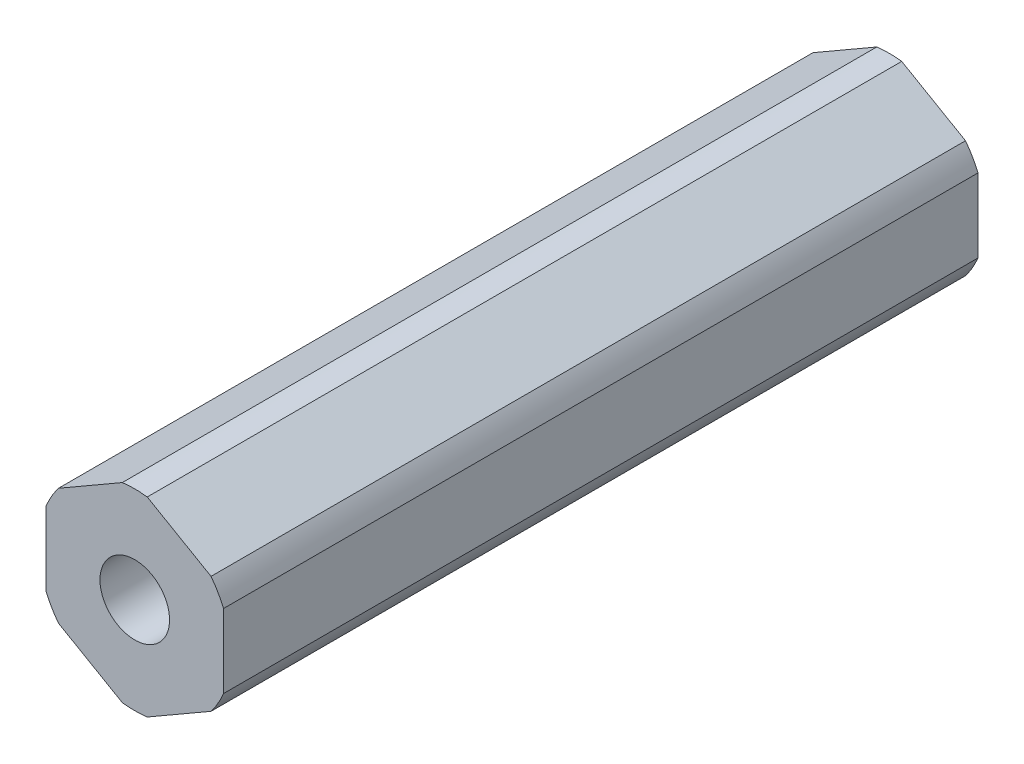
ISO-10303-21;
HEADER;
FILE_DESCRIPTION(('STEP AP214'),'2;1');
FILE_NAME('part.step','',(''),(''),'','','');
FILE_SCHEMA(('AUTOMOTIVE_DESIGN { 1 0 10303 214 1 1 1 1 }'));
ENDSEC;
DATA;
#1=APPLICATION_CONTEXT('core data for automotive mechanical design processes');
#2=APPLICATION_PROTOCOL_DEFINITION('international standard','automotive_design',2000,#1);
#3=PRODUCT_CONTEXT('',#1,'mechanical');
#4=PRODUCT('Part','Part','',(#3));
#5=PRODUCT_RELATED_PRODUCT_CATEGORY('part','',(#4));
#6=PRODUCT_DEFINITION_FORMATION('','',#4);
#7=PRODUCT_DEFINITION_CONTEXT('part definition',#1,'design');
#8=PRODUCT_DEFINITION('design','',#6,#7);
#9=PRODUCT_DEFINITION_SHAPE('','',#8);
#10=(LENGTH_UNIT() NAMED_UNIT(*) SI_UNIT(.MILLI.,.METRE.));
#11=(NAMED_UNIT(*) PLANE_ANGLE_UNIT() SI_UNIT($,.RADIAN.));
#12=(NAMED_UNIT(*) SI_UNIT($,.STERADIAN.) SOLID_ANGLE_UNIT());
#13=UNCERTAINTY_MEASURE_WITH_UNIT(LENGTH_MEASURE(1.E-05),#10,'distance_accuracy_value','');
#14=(GEOMETRIC_REPRESENTATION_CONTEXT(3) GLOBAL_UNCERTAINTY_ASSIGNED_CONTEXT((#13)) GLOBAL_UNIT_ASSIGNED_CONTEXT((#10,
#11,#12)) REPRESENTATION_CONTEXT('',''));
#15=CARTESIAN_POINT('',(0.,0.,0.));
#16=DIRECTION('',(0.,0.,1.));
#17=DIRECTION('',(1.,0.,0.));
#18=AXIS2_PLACEMENT_3D('',#15,#16,#17);
#19=CARTESIAN_POINT('',(6.35,0.,53.975));
#20=DIRECTION('',(-1.,0.,0.));
#21=DIRECTION('',(0.,-1.,0.));
#22=AXIS2_PLACEMENT_3D('',#19,#20,#21);
#23=PLANE('',#22);
#24=DIRECTION('',(0.,1.,0.));
#25=VECTOR('',#24,1.);
#26=CARTESIAN_POINT('',(6.35,0.,0.));
#27=LINE('',#26,#25);
#28=CARTESIAN_POINT('',(6.35,-2.63498093588929,0.));
#29=VERTEX_POINT('',#28);
#30=CARTESIAN_POINT('',(6.35,2.63498093588929,0.));
#31=VERTEX_POINT('',#30);
#32=EDGE_CURVE('E172',#29,#31,#27,.T.);
#33=ORIENTED_EDGE('',*,*,#32,.T.);
#34=DIRECTION('',(0.,0.,-1.));
#35=VECTOR('',#34,1.);
#36=CARTESIAN_POINT('',(6.35,2.63498093588929,53.975));
#37=LINE('',#36,#35);
#38=CARTESIAN_POINT('',(6.35,2.63498093588929,53.975));
#39=VERTEX_POINT('',#38);
#40=EDGE_CURVE('E11',#39,#31,#37,.T.);
#41=ORIENTED_EDGE('',*,*,#40,.F.);
#42=DIRECTION('',(0.,1.,0.));
#43=VECTOR('',#42,1.);
#44=CARTESIAN_POINT('',(6.35,0.,53.975));
#45=LINE('',#44,#43);
#46=CARTESIAN_POINT('',(6.35,-2.63498093588929,53.975));
#47=VERTEX_POINT('',#46);
#48=EDGE_CURVE('E252',#47,#39,#45,.T.);
#49=ORIENTED_EDGE('',*,*,#48,.F.);
#50=DIRECTION('',(0.,0.,-1.));
#51=VECTOR('',#50,1.);
#52=CARTESIAN_POINT('',(6.35,-2.63498093588929,53.975));
#53=LINE('',#52,#51);
#54=EDGE_CURVE('E168',#47,#29,#53,.T.);
#55=ORIENTED_EDGE('',*,*,#54,.T.);
#56=EDGE_LOOP('',(#33,#41,#49,#55));
#57=FACE_BOUND('',#56,.T.);
#58=ADVANCED_FACE('F45',(#57),#23,.F.);
#59=CARTESIAN_POINT('',(0.,0.,53.975));
#60=DIRECTION('',(0.,0.,-1.));
#61=DIRECTION('',(-1.,0.,0.));
#62=AXIS2_PLACEMENT_3D('',#59,#60,#61);
#63=CYLINDRICAL_SURFACE('',#62,6.874999966);
#64=CARTESIAN_POINT('',(0.,0.,0.));
#65=DIRECTION('',(0.,0.,1.));
#66=DIRECTION('',(1.,0.,0.));
#67=AXIS2_PLACEMENT_3D('',#64,#65,#66);
#68=CIRCLE('',#67,6.874999966);
#69=CARTESIAN_POINT('',(5.45696042896782,4.18177084608655,0.));
#70=VERTEX_POINT('',#69);
#71=EDGE_CURVE('E176',#31,#70,#68,.T.);
#72=ORIENTED_EDGE('',*,*,#71,.T.);
#73=DIRECTION('',(0.,0.,-1.));
#74=VECTOR('',#73,1.);
#75=CARTESIAN_POINT('',(5.45696042896782,4.18177084608655,53.975));
#76=LINE('',#75,#74);
#77=CARTESIAN_POINT('',(5.45696042896782,4.18177084608655,53.975));
#78=VERTEX_POINT('',#77);
#79=EDGE_CURVE('E55',#78,#70,#76,.T.);
#80=ORIENTED_EDGE('',*,*,#79,.F.);
#81=CARTESIAN_POINT('',(0.,0.,53.975));
#82=DIRECTION('',(0.,0.,1.));
#83=DIRECTION('',(1.,0.,0.));
#84=AXIS2_PLACEMENT_3D('',#81,#82,#83);
#85=CIRCLE('',#84,6.874999966);
#86=EDGE_CURVE('E118',#39,#78,#85,.T.);
#87=ORIENTED_EDGE('',*,*,#86,.F.);
#88=ORIENTED_EDGE('',*,*,#40,.T.);
#89=EDGE_LOOP('',(#72,#80,#87,#88));
#90=FACE_BOUND('',#89,.T.);
#91=ADVANCED_FACE('F295',(#90),#63,.T.);
#92=CARTESIAN_POINT('',(3.175,5.49926131403119,53.975));
#93=DIRECTION('',(-0.5,-0.866025403784439,0.));
#94=DIRECTION('',(0.866025403784439,-0.5,0.));
#95=AXIS2_PLACEMENT_3D('',#92,#93,#94);
#96=PLANE('',#95);
#97=DIRECTION('',(-0.866025403784439,0.5,0.));
#98=VECTOR('',#97,1.);
#99=CARTESIAN_POINT('',(3.175,5.49926131403119,0.));
#100=LINE('',#99,#98);
#101=CARTESIAN_POINT('',(0.893039571032188,6.81675178197583,0.));
#102=VERTEX_POINT('',#101);
#103=EDGE_CURVE('E179',#70,#102,#100,.T.);
#104=ORIENTED_EDGE('',*,*,#103,.T.);
#105=DIRECTION('',(0.,0.,-1.));
#106=VECTOR('',#105,1.);
#107=CARTESIAN_POINT('',(0.893039571032188,6.81675178197583,53.975));
#108=LINE('',#107,#106);
#109=CARTESIAN_POINT('',(0.893039571032188,6.81675178197583,53.975));
#110=VERTEX_POINT('',#109);
#111=EDGE_CURVE('E222',#110,#102,#108,.T.);
#112=ORIENTED_EDGE('',*,*,#111,.F.);
#113=DIRECTION('',(-0.866025403784439,0.5,0.));
#114=VECTOR('',#113,1.);
#115=CARTESIAN_POINT('',(3.175,5.49926131403119,53.975));
#116=LINE('',#115,#114);
#117=EDGE_CURVE('E233',#78,#110,#116,.T.);
#118=ORIENTED_EDGE('',*,*,#117,.F.);
#119=ORIENTED_EDGE('',*,*,#79,.T.);
#120=EDGE_LOOP('',(#104,#112,#118,#119));
#121=FACE_BOUND('',#120,.T.);
#122=ADVANCED_FACE('F231',(#121),#96,.F.);
#123=CARTESIAN_POINT('',(-0.893039571032174,6.81675178197583,0.));
#124=VERTEX_POINT('',#123);
#125=EDGE_CURVE('E180',#102,#124,#68,.T.);
#126=ORIENTED_EDGE('',*,*,#125,.T.);
#127=DIRECTION('',(0.,0.,-1.));
#128=VECTOR('',#127,1.);
#129=CARTESIAN_POINT('',(-0.893039571032174,6.81675178197583,53.975));
#130=LINE('',#129,#128);
#131=CARTESIAN_POINT('',(-0.893039571032174,6.81675178197583,53.975));
#132=VERTEX_POINT('',#131);
#133=EDGE_CURVE('E218',#132,#124,#130,.T.);
#134=ORIENTED_EDGE('',*,*,#133,.F.);
#135=EDGE_CURVE('E258',#110,#132,#85,.T.);
#136=ORIENTED_EDGE('',*,*,#135,.F.);
#137=ORIENTED_EDGE('',*,*,#111,.T.);
#138=EDGE_LOOP('',(#126,#134,#136,#137));
#139=FACE_BOUND('',#138,.T.);
#140=ADVANCED_FACE('F278',(#139),#63,.T.);
#141=CARTESIAN_POINT('',(-3.175,5.49926131403118,53.975));
#142=DIRECTION('',(0.5,-0.866025403784439,0.));
#143=DIRECTION('',(0.866025403784439,0.5,0.));
#144=AXIS2_PLACEMENT_3D('',#141,#142,#143);
#145=PLANE('',#144);
#146=DIRECTION('',(-0.866025403784439,-0.5,0.));
#147=VECTOR('',#146,1.);
#148=CARTESIAN_POINT('',(-3.175,5.49926131403118,0.));
#149=LINE('',#148,#147);
#150=CARTESIAN_POINT('',(-5.45696042896783,4.18177084608653,0.));
#151=VERTEX_POINT('',#150);
#152=EDGE_CURVE('E183',#124,#151,#149,.T.);
#153=ORIENTED_EDGE('',*,*,#152,.T.);
#154=DIRECTION('',(0.,0.,-1.));
#155=VECTOR('',#154,1.);
#156=CARTESIAN_POINT('',(-5.45696042896783,4.18177084608653,53.975));
#157=LINE('',#156,#155);
#158=CARTESIAN_POINT('',(-5.45696042896783,4.18177084608653,53.975));
#159=VERTEX_POINT('',#158);
#160=EDGE_CURVE('E214',#159,#151,#157,.T.);
#161=ORIENTED_EDGE('',*,*,#160,.F.);
#162=DIRECTION('',(-0.866025403784439,-0.5,0.));
#163=VECTOR('',#162,1.);
#164=CARTESIAN_POINT('',(-3.175,5.49926131403118,53.975));
#165=LINE('',#164,#163);
#166=EDGE_CURVE('E264',#132,#159,#165,.T.);
#167=ORIENTED_EDGE('',*,*,#166,.F.);
#168=ORIENTED_EDGE('',*,*,#133,.T.);
#169=EDGE_LOOP('',(#153,#161,#167,#168));
#170=FACE_BOUND('',#169,.T.);
#171=ADVANCED_FACE('F280',(#170),#145,.F.);
#172=CARTESIAN_POINT('',(-6.35,2.6349809358893,0.));
#173=VERTEX_POINT('',#172);
#174=EDGE_CURVE('E186',#151,#173,#68,.T.);
#175=ORIENTED_EDGE('',*,*,#174,.T.);
#176=DIRECTION('',(0.,0.,-1.));
#177=VECTOR('',#176,1.);
#178=CARTESIAN_POINT('',(-6.35,2.6349809358893,53.975));
#179=LINE('',#178,#177);
#180=CARTESIAN_POINT('',(-6.35,2.6349809358893,53.975));
#181=VERTEX_POINT('',#180);
#182=EDGE_CURVE('E210',#181,#173,#179,.T.);
#183=ORIENTED_EDGE('',*,*,#182,.F.);
#184=EDGE_CURVE('E266',#159,#181,#85,.T.);
#185=ORIENTED_EDGE('',*,*,#184,.F.);
#186=ORIENTED_EDGE('',*,*,#160,.T.);
#187=EDGE_LOOP('',(#175,#183,#185,#186));
#188=FACE_BOUND('',#187,.T.);
#189=ADVANCED_FACE('F281',(#188),#63,.T.);
#190=CARTESIAN_POINT('',(-6.35,0.,53.975));
#191=DIRECTION('',(1.,0.,0.));
#192=DIRECTION('',(0.,1.,0.));
#193=AXIS2_PLACEMENT_3D('',#190,#191,#192);
#194=PLANE('',#193);
#195=DIRECTION('',(0.,-1.,0.));
#196=VECTOR('',#195,1.);
#197=CARTESIAN_POINT('',(-6.35,0.,0.));
#198=LINE('',#197,#196);
#199=CARTESIAN_POINT('',(-6.35,-2.6349809358893,0.));
#200=VERTEX_POINT('',#199);
#201=EDGE_CURVE('E187',#173,#200,#198,.T.);
#202=ORIENTED_EDGE('',*,*,#201,.T.);
#203=DIRECTION('',(0.,0.,-1.));
#204=VECTOR('',#203,1.);
#205=CARTESIAN_POINT('',(-6.35,-2.6349809358893,53.975));
#206=LINE('',#205,#204);
#207=CARTESIAN_POINT('',(-6.35,-2.6349809358893,53.975));
#208=VERTEX_POINT('',#207);
#209=EDGE_CURVE('E206',#208,#200,#206,.T.);
#210=ORIENTED_EDGE('',*,*,#209,.F.);
#211=DIRECTION('',(0.,-1.,0.));
#212=VECTOR('',#211,1.);
#213=CARTESIAN_POINT('',(-6.35,0.,53.975));
#214=LINE('',#213,#212);
#215=EDGE_CURVE('E267',#181,#208,#214,.T.);
#216=ORIENTED_EDGE('',*,*,#215,.F.);
#217=ORIENTED_EDGE('',*,*,#182,.T.);
#218=EDGE_LOOP('',(#202,#210,#216,#217));
#219=FACE_BOUND('',#218,.T.);
#220=ADVANCED_FACE('F284',(#219),#194,.F.);
#221=CARTESIAN_POINT('',(-5.45696042896782,-4.18177084608655,0.));
#222=VERTEX_POINT('',#221);
#223=EDGE_CURVE('E190',#200,#222,#68,.T.);
#224=ORIENTED_EDGE('',*,*,#223,.T.);
#225=DIRECTION('',(0.,0.,-1.));
#226=VECTOR('',#225,1.);
#227=CARTESIAN_POINT('',(-5.45696042896782,-4.18177084608655,53.975));
#228=LINE('',#227,#226);
#229=CARTESIAN_POINT('',(-5.45696042896782,-4.18177084608655,53.975));
#230=VERTEX_POINT('',#229);
#231=EDGE_CURVE('E202',#230,#222,#228,.T.);
#232=ORIENTED_EDGE('',*,*,#231,.F.);
#233=EDGE_CURVE('E155',#208,#230,#85,.T.);
#234=ORIENTED_EDGE('',*,*,#233,.F.);
#235=ORIENTED_EDGE('',*,*,#209,.T.);
#236=EDGE_LOOP('',(#224,#232,#234,#235));
#237=FACE_BOUND('',#236,.T.);
#238=ADVANCED_FACE('F286',(#237),#63,.T.);
#239=CARTESIAN_POINT('',(-3.175,-5.49926131403119,53.975));
#240=DIRECTION('',(0.5,0.866025403784438,0.));
#241=DIRECTION('',(-0.866025403784438,0.5,0.));
#242=AXIS2_PLACEMENT_3D('',#239,#240,#241);
#243=PLANE('',#242);
#244=DIRECTION('',(0.866025403784438,-0.5,0.));
#245=VECTOR('',#244,1.);
#246=CARTESIAN_POINT('',(-3.175,-5.49926131403119,0.));
#247=LINE('',#246,#245);
#248=CARTESIAN_POINT('',(-0.893039571032192,-6.81675178197583,0.));
#249=VERTEX_POINT('',#248);
#250=EDGE_CURVE('E191',#222,#249,#247,.T.);
#251=ORIENTED_EDGE('',*,*,#250,.T.);
#252=DIRECTION('',(0.,0.,-1.));
#253=VECTOR('',#252,1.);
#254=CARTESIAN_POINT('',(-0.893039571032192,-6.81675178197583,53.975));
#255=LINE('',#254,#253);
#256=CARTESIAN_POINT('',(-0.893039571032192,-6.81675178197583,53.975));
#257=VERTEX_POINT('',#256);
#258=EDGE_CURVE('E161',#257,#249,#255,.T.);
#259=ORIENTED_EDGE('',*,*,#258,.F.);
#260=DIRECTION('',(0.866025403784438,-0.5,0.));
#261=VECTOR('',#260,1.);
#262=CARTESIAN_POINT('',(-3.175,-5.49926131403119,53.975));
#263=LINE('',#262,#261);
#264=EDGE_CURVE('E149',#230,#257,#263,.T.);
#265=ORIENTED_EDGE('',*,*,#264,.F.);
#266=ORIENTED_EDGE('',*,*,#231,.T.);
#267=EDGE_LOOP('',(#251,#259,#265,#266));
#268=FACE_BOUND('',#267,.T.);
#269=ADVANCED_FACE('F289',(#268),#243,.F.);
#270=CARTESIAN_POINT('',(0.893039571032187,-6.81675178197583,0.));
#271=VERTEX_POINT('',#270);
#272=EDGE_CURVE('E159',#249,#271,#68,.T.);
#273=ORIENTED_EDGE('',*,*,#272,.T.);
#274=DIRECTION('',(0.,0.,-1.));
#275=VECTOR('',#274,1.);
#276=CARTESIAN_POINT('',(0.893039571032187,-6.81675178197583,53.975));
#277=LINE('',#276,#275);
#278=CARTESIAN_POINT('',(0.893039571032187,-6.81675178197583,53.975));
#279=VERTEX_POINT('',#278);
#280=EDGE_CURVE('E156',#279,#271,#277,.T.);
#281=ORIENTED_EDGE('',*,*,#280,.F.);
#282=EDGE_CURVE('E143',#257,#279,#85,.T.);
#283=ORIENTED_EDGE('',*,*,#282,.F.);
#284=ORIENTED_EDGE('',*,*,#258,.T.);
#285=EDGE_LOOP('',(#273,#281,#283,#284));
#286=FACE_BOUND('',#285,.T.);
#287=ADVANCED_FACE('F157',(#286),#63,.T.);
#288=CARTESIAN_POINT('',(3.175,-5.49926131403119,53.975));
#289=DIRECTION('',(-0.5,0.866025403784438,0.));
#290=DIRECTION('',(-0.866025403784439,-0.5,0.));
#291=AXIS2_PLACEMENT_3D('',#288,#289,#290);
#292=PLANE('',#291);
#293=DIRECTION('',(0.866025403784439,0.5,0.));
#294=VECTOR('',#293,1.);
#295=CARTESIAN_POINT('',(3.175,-5.49926131403119,0.));
#296=LINE('',#295,#294);
#297=CARTESIAN_POINT('',(5.45696042896782,-4.18177084608654,0.));
#298=VERTEX_POINT('',#297);
#299=EDGE_CURVE('E104',#271,#298,#296,.T.);
#300=ORIENTED_EDGE('',*,*,#299,.T.);
#301=DIRECTION('',(0.,0.,-1.));
#302=VECTOR('',#301,1.);
#303=CARTESIAN_POINT('',(5.45696042896782,-4.18177084608654,53.975));
#304=LINE('',#303,#302);
#305=CARTESIAN_POINT('',(5.45696042896782,-4.18177084608654,53.975));
#306=VERTEX_POINT('',#305);
#307=EDGE_CURVE('E162',#306,#298,#304,.T.);
#308=ORIENTED_EDGE('',*,*,#307,.F.);
#309=DIRECTION('',(0.866025403784439,0.5,0.));
#310=VECTOR('',#309,1.);
#311=CARTESIAN_POINT('',(3.175,-5.49926131403119,53.975));
#312=LINE('',#311,#310);
#313=EDGE_CURVE('E147',#279,#306,#312,.T.);
#314=ORIENTED_EDGE('',*,*,#313,.F.);
#315=ORIENTED_EDGE('',*,*,#280,.T.);
#316=EDGE_LOOP('',(#300,#308,#314,#315));
#317=FACE_BOUND('',#316,.T.);
#318=ADVANCED_FACE('F164',(#317),#292,.F.);
#319=EDGE_CURVE('E110',#298,#29,#68,.T.);
#320=ORIENTED_EDGE('',*,*,#319,.T.);
#321=ORIENTED_EDGE('',*,*,#54,.F.);
#322=EDGE_CURVE('E63',#306,#47,#85,.T.);
#323=ORIENTED_EDGE('',*,*,#322,.F.);
#324=ORIENTED_EDGE('',*,*,#307,.T.);
#325=EDGE_LOOP('',(#320,#321,#323,#324));
#326=FACE_BOUND('',#325,.T.);
#327=ADVANCED_FACE('F292',(#326),#63,.T.);
#328=CARTESIAN_POINT('',(0.,0.,53.975));
#329=DIRECTION('',(0.,0.,1.));
#330=DIRECTION('',(1.,0.,0.));
#331=AXIS2_PLACEMENT_3D('',#328,#329,#330);
#332=PLANE('',#331);
#333=CARTESIAN_POINT('',(0.,0.,53.975));
#334=DIRECTION('',(0.,0.,-1.));
#335=DIRECTION('',(-1.,0.,0.));
#336=AXIS2_PLACEMENT_3D('',#333,#334,#335);
#337=CIRCLE('',#336,2.4892);
#338=CARTESIAN_POINT('',(-2.4892,0.,53.975));
#339=VERTEX_POINT('',#338);
#340=EDGE_CURVE('E260',#339,#339,#337,.T.);
#341=ORIENTED_EDGE('',*,*,#340,.T.);
#342=EDGE_LOOP('',(#341));
#343=FACE_BOUND('',#342,.T.);
#344=ORIENTED_EDGE('',*,*,#48,.T.);
#345=ORIENTED_EDGE('',*,*,#86,.T.);
#346=ORIENTED_EDGE('',*,*,#117,.T.);
#347=ORIENTED_EDGE('',*,*,#135,.T.);
#348=ORIENTED_EDGE('',*,*,#166,.T.);
#349=ORIENTED_EDGE('',*,*,#184,.T.);
#350=ORIENTED_EDGE('',*,*,#215,.T.);
#351=ORIENTED_EDGE('',*,*,#233,.T.);
#352=ORIENTED_EDGE('',*,*,#264,.T.);
#353=ORIENTED_EDGE('',*,*,#282,.T.);
#354=ORIENTED_EDGE('',*,*,#313,.T.);
#355=ORIENTED_EDGE('',*,*,#322,.T.);
#356=EDGE_LOOP('',(#344,#345,#346,#347,#348,#349,#350,#351,#352,#353,#354,#355));
#357=FACE_BOUND('',#356,.T.);
#358=ADVANCED_FACE('F145',(#343,#357),#332,.T.);
#359=CARTESIAN_POINT('',(0.,0.,0.));
#360=DIRECTION('',(0.,0.,1.));
#361=DIRECTION('',(1.,0.,0.));
#362=AXIS2_PLACEMENT_3D('',#359,#360,#361);
#363=PLANE('',#362);
#364=CARTESIAN_POINT('',(0.,0.,0.));
#365=DIRECTION('',(0.,0.,1.));
#366=DIRECTION('',(1.,0.,0.));
#367=AXIS2_PLACEMENT_3D('',#364,#365,#366);
#368=CIRCLE('',#367,2.4892);
#369=CARTESIAN_POINT('',(2.4892,0.,0.));
#370=VERTEX_POINT('',#369);
#371=EDGE_CURVE('E48',#370,#370,#368,.T.);
#372=ORIENTED_EDGE('',*,*,#371,.T.);
#373=EDGE_LOOP('',(#372));
#374=FACE_BOUND('',#373,.T.);
#375=ORIENTED_EDGE('',*,*,#32,.F.);
#376=ORIENTED_EDGE('',*,*,#319,.F.);
#377=ORIENTED_EDGE('',*,*,#299,.F.);
#378=ORIENTED_EDGE('',*,*,#272,.F.);
#379=ORIENTED_EDGE('',*,*,#250,.F.);
#380=ORIENTED_EDGE('',*,*,#223,.F.);
#381=ORIENTED_EDGE('',*,*,#201,.F.);
#382=ORIENTED_EDGE('',*,*,#174,.F.);
#383=ORIENTED_EDGE('',*,*,#152,.F.);
#384=ORIENTED_EDGE('',*,*,#125,.F.);
#385=ORIENTED_EDGE('',*,*,#103,.F.);
#386=ORIENTED_EDGE('',*,*,#71,.F.);
#387=EDGE_LOOP('',(#375,#376,#377,#378,#379,#380,#381,#382,#383,#384,#385,#386));
#388=FACE_BOUND('',#387,.T.);
#389=ADVANCED_FACE('F237',(#374,#388),#363,.F.);
#390=CARTESIAN_POINT('',(0.,0.,53.975));
#391=DIRECTION('',(0.,0.,-1.));
#392=DIRECTION('',(-1.,0.,0.));
#393=AXIS2_PLACEMENT_3D('',#390,#391,#392);
#394=CYLINDRICAL_SURFACE('',#393,2.4892);
#395=ORIENTED_EDGE('',*,*,#340,.F.);
#396=EDGE_LOOP('',(#395));
#397=FACE_BOUND('',#396,.T.);
#398=ORIENTED_EDGE('',*,*,#371,.F.);
#399=EDGE_LOOP('',(#398));
#400=FACE_BOUND('',#399,.T.);
#401=ADVANCED_FACE('F389',(#397,#400),#394,.F.);
#402=CLOSED_SHELL('',(#58,#91,#122,#140,#171,#189,#220,#238,#269,#287,#318,#327,#358,#389,#401));
#403=MANIFOLD_SOLID_BREP('B2',#402);
#404=ADVANCED_BREP_SHAPE_REPRESENTATION('',(#18,#403),#14);
#405=SHAPE_DEFINITION_REPRESENTATION(#9,#404);
ENDSEC;
END-ISO-10303-21;
